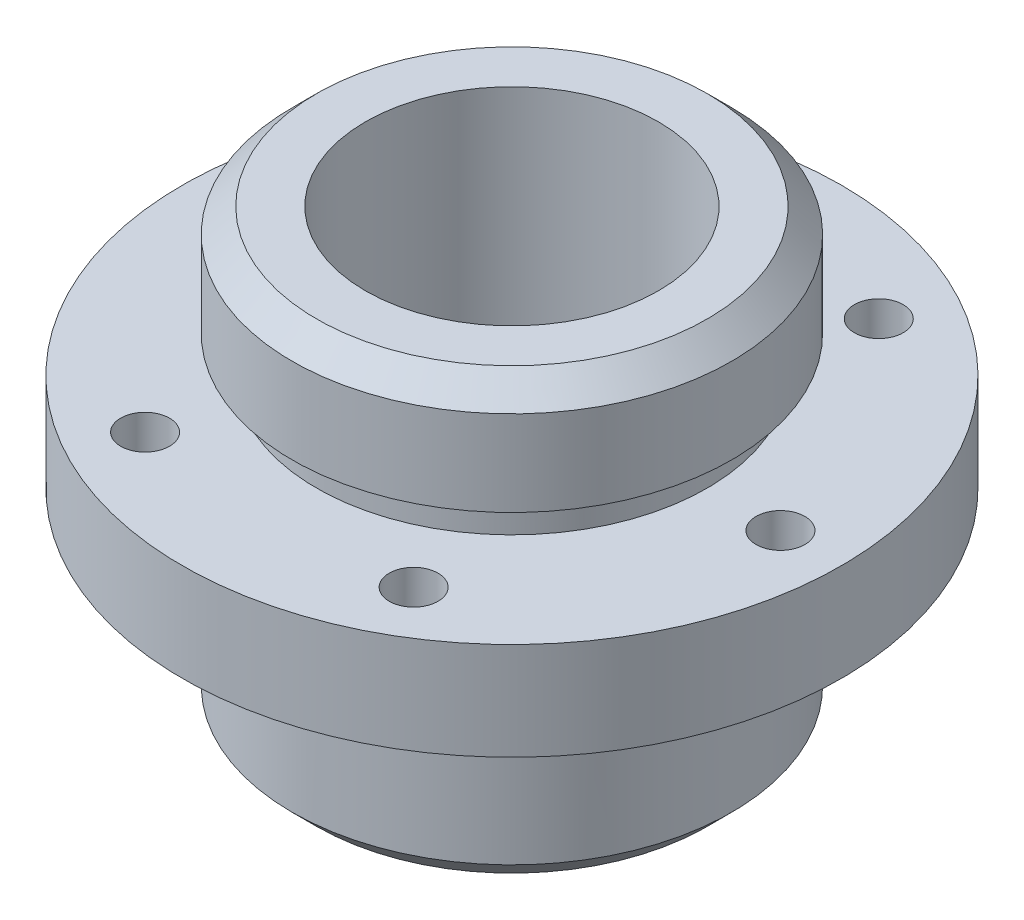
ISO-10303-21;
HEADER;
FILE_DESCRIPTION(('STEP AP214'),'2;1');
FILE_NAME('part.step','',(''),(''),'','','');
FILE_SCHEMA(('AUTOMOTIVE_DESIGN { 1 0 10303 214 1 1 1 1 }'));
ENDSEC;
DATA;
#1=APPLICATION_CONTEXT('core data for automotive mechanical design processes');
#2=APPLICATION_PROTOCOL_DEFINITION('international standard','automotive_design',2000,#1);
#3=PRODUCT_CONTEXT('',#1,'mechanical');
#4=PRODUCT('Part','Part','',(#3));
#5=PRODUCT_RELATED_PRODUCT_CATEGORY('part','',(#4));
#6=PRODUCT_DEFINITION_FORMATION('','',#4);
#7=PRODUCT_DEFINITION_CONTEXT('part definition',#1,'design');
#8=PRODUCT_DEFINITION('design','',#6,#7);
#9=PRODUCT_DEFINITION_SHAPE('','',#8);
#10=(LENGTH_UNIT() NAMED_UNIT(*) SI_UNIT(.MILLI.,.METRE.));
#11=(NAMED_UNIT(*) PLANE_ANGLE_UNIT() SI_UNIT($,.RADIAN.));
#12=(NAMED_UNIT(*) SI_UNIT($,.STERADIAN.) SOLID_ANGLE_UNIT());
#13=UNCERTAINTY_MEASURE_WITH_UNIT(LENGTH_MEASURE(1.E-05),#10,'distance_accuracy_value','');
#14=(GEOMETRIC_REPRESENTATION_CONTEXT(3) GLOBAL_UNCERTAINTY_ASSIGNED_CONTEXT((#13)) GLOBAL_UNIT_ASSIGNED_CONTEXT((#10,
#11,#12)) REPRESENTATION_CONTEXT('',''));
#15=CARTESIAN_POINT('',(0.,0.,0.));
#16=DIRECTION('',(0.,0.,1.));
#17=DIRECTION('',(1.,0.,0.));
#18=AXIS2_PLACEMENT_3D('',#15,#16,#17);
#19=CARTESIAN_POINT('',(-36.,0.,0.));
#20=DIRECTION('',(0.,1.,0.));
#21=DIRECTION('',(0.,0.,1.));
#22=AXIS2_PLACEMENT_3D('',#19,#20,#21);
#23=PLANE('',#22);
#24=CARTESIAN_POINT('',(0.,0.,0.));
#25=DIRECTION('',(0.,1.,0.));
#26=DIRECTION('',(0.,0.,1.));
#27=AXIS2_PLACEMENT_3D('',#24,#25,#26);
#28=CIRCLE('',#27,32.);
#29=CARTESIAN_POINT('',(0.,0.,32.));
#30=VERTEX_POINT('',#29);
#31=EDGE_CURVE('E62',#30,#30,#28,.F.);
#32=ORIENTED_EDGE('',*,*,#31,.T.);
#33=EDGE_LOOP('',(#32));
#34=FACE_BOUND('',#33,.T.);
#35=CARTESIAN_POINT('',(0.,0.,0.));
#36=DIRECTION('',(0.,-1.,0.));
#37=DIRECTION('',(0.,0.,-1.));
#38=AXIS2_PLACEMENT_3D('',#35,#36,#37);
#39=CIRCLE('',#38,24.);
#40=CARTESIAN_POINT('',(0.,0.,-24.));
#41=VERTEX_POINT('',#40);
#42=EDGE_CURVE('E68',#41,#41,#39,.T.);
#43=ORIENTED_EDGE('',*,*,#42,.F.);
#44=EDGE_LOOP('',(#43));
#45=FACE_BOUND('',#44,.T.);
#46=ADVANCED_FACE('F43',(#34,#45),#23,.F.);
#47=CARTESIAN_POINT('',(0.,0.,0.));
#48=DIRECTION('',(0.,-1.,0.));
#49=DIRECTION('',(0.,0.,-1.));
#50=AXIS2_PLACEMENT_3D('',#47,#48,#49);
#51=CYLINDRICAL_SURFACE('',#50,24.);
#52=CARTESIAN_POINT('',(0.,72.,0.));
#53=DIRECTION('',(0.,-1.,0.));
#54=DIRECTION('',(0.,0.,-1.));
#55=AXIS2_PLACEMENT_3D('',#52,#53,#54);
#56=CIRCLE('',#55,24.);
#57=CARTESIAN_POINT('',(0.,72.,-24.));
#58=VERTEX_POINT('',#57);
#59=EDGE_CURVE('E72',#58,#58,#56,.T.);
#60=ORIENTED_EDGE('',*,*,#59,.F.);
#61=EDGE_LOOP('',(#60));
#62=FACE_BOUND('',#61,.T.);
#63=ORIENTED_EDGE('',*,*,#42,.T.);
#64=EDGE_LOOP('',(#63));
#65=FACE_BOUND('',#64,.T.);
#66=ADVANCED_FACE('F218',(#62,#65),#51,.F.);
#67=CARTESIAN_POINT('',(-24.,72.,0.));
#68=DIRECTION('',(0.,-1.,0.));
#69=DIRECTION('',(0.,0.,-1.));
#70=AXIS2_PLACEMENT_3D('',#67,#68,#69);
#71=PLANE('',#70);
#72=CARTESIAN_POINT('',(0.,72.,0.));
#73=DIRECTION('',(0.,-1.,0.));
#74=DIRECTION('',(0.,0.,-1.));
#75=AXIS2_PLACEMENT_3D('',#72,#73,#74);
#76=CIRCLE('',#75,32.);
#77=CARTESIAN_POINT('',(0.,72.,-32.));
#78=VERTEX_POINT('',#77);
#79=EDGE_CURVE('E10',#78,#78,#76,.F.);
#80=ORIENTED_EDGE('',*,*,#79,.T.);
#81=EDGE_LOOP('',(#80));
#82=FACE_BOUND('',#81,.T.);
#83=ORIENTED_EDGE('',*,*,#59,.T.);
#84=EDGE_LOOP('',(#83));
#85=FACE_BOUND('',#84,.T.);
#86=ADVANCED_FACE('F213',(#82,#85),#71,.F.);
#87=CARTESIAN_POINT('',(0.,0.,0.));
#88=DIRECTION('',(0.,-1.,0.));
#89=DIRECTION('',(0.,0.,-1.));
#90=AXIS2_PLACEMENT_3D('',#87,#88,#89);
#91=CYLINDRICAL_SURFACE('',#90,36.);
#92=CARTESIAN_POINT('',(0.,68.,0.));
#93=DIRECTION('',(0.,-1.,0.));
#94=DIRECTION('',(0.,0.,-1.));
#95=AXIS2_PLACEMENT_3D('',#92,#93,#94);
#96=CIRCLE('',#95,36.);
#97=CARTESIAN_POINT('',(0.,68.,-36.));
#98=VERTEX_POINT('',#97);
#99=EDGE_CURVE('E52',#98,#98,#96,.T.);
#100=ORIENTED_EDGE('',*,*,#99,.T.);
#101=EDGE_LOOP('',(#100));
#102=FACE_BOUND('',#101,.T.);
#103=CARTESIAN_POINT('',(0.,54.,0.));
#104=DIRECTION('',(0.,-1.,0.));
#105=DIRECTION('',(0.,0.,-1.));
#106=AXIS2_PLACEMENT_3D('',#103,#104,#105);
#107=CIRCLE('',#106,36.);
#108=CARTESIAN_POINT('',(0.,54.,-36.));
#109=VERTEX_POINT('',#108);
#110=EDGE_CURVE('E76',#109,#109,#107,.T.);
#111=ORIENTED_EDGE('',*,*,#110,.F.);
#112=EDGE_LOOP('',(#111));
#113=FACE_BOUND('',#112,.T.);
#114=ADVANCED_FACE('F208',(#102,#113),#91,.T.);
#115=CARTESIAN_POINT('',(-36.,54.,0.));
#116=DIRECTION('',(0.,1.,0.));
#117=DIRECTION('',(0.,0.,1.));
#118=AXIS2_PLACEMENT_3D('',#115,#116,#117);
#119=PLANE('',#118);
#120=CARTESIAN_POINT('',(0.,54.,0.));
#121=DIRECTION('',(0.,-1.,0.));
#122=DIRECTION('',(0.,0.,-1.));
#123=AXIS2_PLACEMENT_3D('',#120,#121,#122);
#124=CIRCLE('',#123,34.8823067684916);
#125=CARTESIAN_POINT('',(0.,54.,-34.8823067684916));
#126=VERTEX_POINT('',#125);
#127=EDGE_CURVE('E80',#126,#126,#124,.T.);
#128=ORIENTED_EDGE('',*,*,#127,.F.);
#129=EDGE_LOOP('',(#128));
#130=FACE_BOUND('',#129,.T.);
#131=ORIENTED_EDGE('',*,*,#110,.T.);
#132=EDGE_LOOP('',(#131));
#133=FACE_BOUND('',#132,.T.);
#134=ADVANCED_FACE('F202',(#130,#133),#119,.F.);
#135=CARTESIAN_POINT('',(0.,50.0392310771694,0.));
#136=DIRECTION('',(0.,-1.,0.));
#137=DIRECTION('',(0.,0.,-1.));
#138=AXIS2_PLACEMENT_3D('',#135,#136,#137);
#139=TOROIDAL_SURFACE('',#138,35.4411533842458,4.);
#140=CARTESIAN_POINT('',(0.,52.8127320582956,0.));
#141=DIRECTION('',(0.,-1.,0.));
#142=DIRECTION('',(0.,0.,-1.));
#143=AXIS2_PLACEMENT_3D('',#140,#141,#142);
#144=CIRCLE('',#143,32.5588466157542);
#145=CARTESIAN_POINT('',(0.,52.8127320582956,-32.5588466157542));
#146=VERTEX_POINT('',#145);
#147=EDGE_CURVE('E84',#146,#146,#144,.T.);
#148=ORIENTED_EDGE('',*,*,#147,.F.);
#149=EDGE_LOOP('',(#148));
#150=FACE_BOUND('',#149,.T.);
#151=ORIENTED_EDGE('',*,*,#127,.T.);
#152=EDGE_LOOP('',(#151));
#153=FACE_BOUND('',#152,.T.);
#154=ADVANCED_FACE('F196',(#150,#153),#139,.F.);
#155=CARTESIAN_POINT('',(0.,51.4259815677325,0.));
#156=DIRECTION('',(0.,-1.,0.));
#157=DIRECTION('',(0.,0.,-1.));
#158=AXIS2_PLACEMENT_3D('',#155,#156,#157);
#159=TOROIDAL_SURFACE('',#158,34.,2.);
#160=CARTESIAN_POINT('',(0.,51.4259815677325,0.));
#161=DIRECTION('',(0.,-1.,0.));
#162=DIRECTION('',(0.,0.,-1.));
#163=AXIS2_PLACEMENT_3D('',#160,#161,#162);
#164=CIRCLE('',#163,32.);
#165=CARTESIAN_POINT('',(0.,51.4259815677325,-32.));
#166=VERTEX_POINT('',#165);
#167=EDGE_CURVE('E88',#166,#166,#164,.T.);
#168=ORIENTED_EDGE('',*,*,#167,.F.);
#169=EDGE_LOOP('',(#168));
#170=FACE_BOUND('',#169,.T.);
#171=ORIENTED_EDGE('',*,*,#147,.T.);
#172=EDGE_LOOP('',(#171));
#173=FACE_BOUND('',#172,.T.);
#174=ADVANCED_FACE('F190',(#170,#173),#159,.F.);
#175=CARTESIAN_POINT('',(0.,0.,0.));
#176=DIRECTION('',(0.,-1.,0.));
#177=DIRECTION('',(0.,0.,-1.));
#178=AXIS2_PLACEMENT_3D('',#175,#176,#177);
#179=CYLINDRICAL_SURFACE('',#178,32.);
#180=CARTESIAN_POINT('',(0.,48.,0.));
#181=DIRECTION('',(0.,-1.,0.));
#182=DIRECTION('',(0.,0.,-1.));
#183=AXIS2_PLACEMENT_3D('',#180,#181,#182);
#184=CIRCLE('',#183,32.);
#185=CARTESIAN_POINT('',(0.,48.,-32.));
#186=VERTEX_POINT('',#185);
#187=EDGE_CURVE('E92',#186,#186,#184,.T.);
#188=ORIENTED_EDGE('',*,*,#187,.F.);
#189=EDGE_LOOP('',(#188));
#190=FACE_BOUND('',#189,.T.);
#191=ORIENTED_EDGE('',*,*,#167,.T.);
#192=EDGE_LOOP('',(#191));
#193=FACE_BOUND('',#192,.T.);
#194=ADVANCED_FACE('F172',(#190,#193),#179,.T.);
#195=CARTESIAN_POINT('',(-32.,48.,0.));
#196=DIRECTION('',(0.,-1.,0.));
#197=DIRECTION('',(0.,0.,-1.));
#198=AXIS2_PLACEMENT_3D('',#195,#196,#197);
#199=PLANE('',#198);
#200=CARTESIAN_POINT('',(44.,48.,0.));
#201=DIRECTION('',(0.,1.,0.));
#202=DIRECTION('',(0.,0.,1.));
#203=AXIS2_PLACEMENT_3D('',#200,#201,#202);
#204=CIRCLE('',#203,4.);
#205=CARTESIAN_POINT('',(44.,48.,4.));
#206=VERTEX_POINT('',#205);
#207=EDGE_CURVE('E147',#206,#206,#204,.T.);
#208=ORIENTED_EDGE('',*,*,#207,.F.);
#209=EDGE_LOOP('',(#208));
#210=FACE_BOUND('',#209,.T.);
#211=CARTESIAN_POINT('',(22.0000000000004,48.,-38.105117766515));
#212=DIRECTION('',(0.,1.,0.));
#213=DIRECTION('',(0.,0.,1.));
#214=AXIS2_PLACEMENT_3D('',#211,#212,#213);
#215=CIRCLE('',#214,3.99999999999999);
#216=CARTESIAN_POINT('',(22.0000000000004,48.,-34.105117766515));
#217=VERTEX_POINT('',#216);
#218=EDGE_CURVE('E126',#217,#217,#215,.T.);
#219=ORIENTED_EDGE('',*,*,#218,.F.);
#220=EDGE_LOOP('',(#219));
#221=FACE_BOUND('',#220,.T.);
#222=CARTESIAN_POINT('',(-21.9999999999996,48.,-38.1051177665155));
#223=DIRECTION('',(0.,1.,0.));
#224=DIRECTION('',(0.,0.,1.));
#225=AXIS2_PLACEMENT_3D('',#222,#223,#224);
#226=CIRCLE('',#225,4.);
#227=CARTESIAN_POINT('',(-21.9999999999996,48.,-34.1051177665155));
#228=VERTEX_POINT('',#227);
#229=EDGE_CURVE('E117',#228,#228,#226,.T.);
#230=ORIENTED_EDGE('',*,*,#229,.F.);
#231=EDGE_LOOP('',(#230));
#232=FACE_BOUND('',#231,.T.);
#233=CARTESIAN_POINT('',(-44.,48.,-3.07250357818196E-13));
#234=DIRECTION('',(0.,1.,0.));
#235=DIRECTION('',(0.,0.,1.));
#236=AXIS2_PLACEMENT_3D('',#233,#234,#235);
#237=CIRCLE('',#236,4.);
#238=CARTESIAN_POINT('',(-44.,48.,3.99999999999969));
#239=VERTEX_POINT('',#238);
#240=EDGE_CURVE('E127',#239,#239,#237,.T.);
#241=ORIENTED_EDGE('',*,*,#240,.F.);
#242=EDGE_LOOP('',(#241));
#243=FACE_BOUND('',#242,.T.);
#244=CARTESIAN_POINT('',(-22.0000000000002,48.,38.1051177665152));
#245=DIRECTION('',(0.,1.,0.));
#246=DIRECTION('',(0.,0.,1.));
#247=AXIS2_PLACEMENT_3D('',#244,#245,#246);
#248=CIRCLE('',#247,4.);
#249=CARTESIAN_POINT('',(-22.0000000000002,48.,42.1051177665152));
#250=VERTEX_POINT('',#249);
#251=EDGE_CURVE('E135',#250,#250,#248,.T.);
#252=ORIENTED_EDGE('',*,*,#251,.F.);
#253=EDGE_LOOP('',(#252));
#254=FACE_BOUND('',#253,.T.);
#255=CARTESIAN_POINT('',(21.9999999999999,48.,38.1051177665154));
#256=DIRECTION('',(0.,1.,0.));
#257=DIRECTION('',(0.,0.,1.));
#258=AXIS2_PLACEMENT_3D('',#255,#256,#257);
#259=CIRCLE('',#258,4.);
#260=CARTESIAN_POINT('',(21.9999999999999,48.,42.1051177665154));
#261=VERTEX_POINT('',#260);
#262=EDGE_CURVE('E143',#261,#261,#259,.T.);
#263=ORIENTED_EDGE('',*,*,#262,.F.);
#264=EDGE_LOOP('',(#263));
#265=FACE_BOUND('',#264,.T.);
#266=CARTESIAN_POINT('',(0.,48.,0.));
#267=DIRECTION('',(0.,-1.,0.));
#268=DIRECTION('',(0.,0.,-1.));
#269=AXIS2_PLACEMENT_3D('',#266,#267,#268);
#270=CIRCLE('',#269,54.);
#271=CARTESIAN_POINT('',(0.,48.,-54.));
#272=VERTEX_POINT('',#271);
#273=EDGE_CURVE('E96',#272,#272,#270,.T.);
#274=ORIENTED_EDGE('',*,*,#273,.F.);
#275=EDGE_LOOP('',(#274));
#276=FACE_BOUND('',#275,.T.);
#277=ORIENTED_EDGE('',*,*,#187,.T.);
#278=EDGE_LOOP('',(#277));
#279=FACE_BOUND('',#278,.T.);
#280=ADVANCED_FACE('F168',(#210,#221,#232,#243,#254,#265,#276,#279),#199,.F.);
#281=CARTESIAN_POINT('',(0.,0.,0.));
#282=DIRECTION('',(0.,-1.,0.));
#283=DIRECTION('',(0.,0.,-1.));
#284=AXIS2_PLACEMENT_3D('',#281,#282,#283);
#285=CYLINDRICAL_SURFACE('',#284,54.);
#286=CARTESIAN_POINT('',(0.,32.,0.));
#287=DIRECTION('',(0.,-1.,0.));
#288=DIRECTION('',(0.,0.,-1.));
#289=AXIS2_PLACEMENT_3D('',#286,#287,#288);
#290=CIRCLE('',#289,54.);
#291=CARTESIAN_POINT('',(0.,32.,-54.));
#292=VERTEX_POINT('',#291);
#293=EDGE_CURVE('E100',#292,#292,#290,.T.);
#294=ORIENTED_EDGE('',*,*,#293,.F.);
#295=EDGE_LOOP('',(#294));
#296=FACE_BOUND('',#295,.T.);
#297=ORIENTED_EDGE('',*,*,#273,.T.);
#298=EDGE_LOOP('',(#297));
#299=FACE_BOUND('',#298,.T.);
#300=ADVANCED_FACE('F171',(#296,#299),#285,.T.);
#301=CARTESIAN_POINT('',(-54.,32.,0.));
#302=DIRECTION('',(0.,1.,0.));
#303=DIRECTION('',(0.,0.,1.));
#304=AXIS2_PLACEMENT_3D('',#301,#302,#303);
#305=PLANE('',#304);
#306=CARTESIAN_POINT('',(44.,32.,0.));
#307=DIRECTION('',(0.,1.,0.));
#308=DIRECTION('',(0.,0.,1.));
#309=AXIS2_PLACEMENT_3D('',#306,#307,#308);
#310=CIRCLE('',#309,4.);
#311=CARTESIAN_POINT('',(44.,32.,4.));
#312=VERTEX_POINT('',#311);
#313=EDGE_CURVE('E116',#312,#312,#310,.F.);
#314=ORIENTED_EDGE('',*,*,#313,.F.);
#315=EDGE_LOOP('',(#314));
#316=FACE_BOUND('',#315,.T.);
#317=CARTESIAN_POINT('',(22.0000000000004,32.,-38.105117766515));
#318=DIRECTION('',(0.,1.,0.));
#319=DIRECTION('',(0.,0.,1.));
#320=AXIS2_PLACEMENT_3D('',#317,#318,#319);
#321=CIRCLE('',#320,3.99999999999999);
#322=CARTESIAN_POINT('',(22.0000000000004,32.,-34.105117766515));
#323=VERTEX_POINT('',#322);
#324=EDGE_CURVE('E154',#323,#323,#321,.F.);
#325=ORIENTED_EDGE('',*,*,#324,.F.);
#326=EDGE_LOOP('',(#325));
#327=FACE_BOUND('',#326,.T.);
#328=CARTESIAN_POINT('',(-21.9999999999996,32.,-38.1051177665155));
#329=DIRECTION('',(0.,1.,0.));
#330=DIRECTION('',(0.,0.,1.));
#331=AXIS2_PLACEMENT_3D('',#328,#329,#330);
#332=CIRCLE('',#331,4.);
#333=CARTESIAN_POINT('',(-21.9999999999996,32.,-34.1051177665155));
#334=VERTEX_POINT('',#333);
#335=EDGE_CURVE('E122',#334,#334,#332,.F.);
#336=ORIENTED_EDGE('',*,*,#335,.F.);
#337=EDGE_LOOP('',(#336));
#338=FACE_BOUND('',#337,.T.);
#339=CARTESIAN_POINT('',(-44.,32.,-3.07250357818196E-13));
#340=DIRECTION('',(0.,1.,0.));
#341=DIRECTION('',(0.,0.,1.));
#342=AXIS2_PLACEMENT_3D('',#339,#340,#341);
#343=CIRCLE('',#342,4.);
#344=CARTESIAN_POINT('',(-44.,32.,3.99999999999969));
#345=VERTEX_POINT('',#344);
#346=EDGE_CURVE('E121',#345,#345,#343,.F.);
#347=ORIENTED_EDGE('',*,*,#346,.F.);
#348=EDGE_LOOP('',(#347));
#349=FACE_BOUND('',#348,.T.);
#350=CARTESIAN_POINT('',(-22.0000000000002,32.,38.1051177665152));
#351=DIRECTION('',(0.,1.,0.));
#352=DIRECTION('',(0.,0.,1.));
#353=AXIS2_PLACEMENT_3D('',#350,#351,#352);
#354=CIRCLE('',#353,4.);
#355=CARTESIAN_POINT('',(-22.0000000000002,32.,42.1051177665152));
#356=VERTEX_POINT('',#355);
#357=EDGE_CURVE('E131',#356,#356,#354,.F.);
#358=ORIENTED_EDGE('',*,*,#357,.F.);
#359=EDGE_LOOP('',(#358));
#360=FACE_BOUND('',#359,.T.);
#361=CARTESIAN_POINT('',(21.9999999999999,32.,38.1051177665154));
#362=DIRECTION('',(0.,1.,0.));
#363=DIRECTION('',(0.,0.,1.));
#364=AXIS2_PLACEMENT_3D('',#361,#362,#363);
#365=CIRCLE('',#364,4.);
#366=CARTESIAN_POINT('',(21.9999999999999,32.,42.1051177665154));
#367=VERTEX_POINT('',#366);
#368=EDGE_CURVE('E139',#367,#367,#365,.F.);
#369=ORIENTED_EDGE('',*,*,#368,.F.);
#370=EDGE_LOOP('',(#369));
#371=FACE_BOUND('',#370,.T.);
#372=CARTESIAN_POINT('',(0.,32.,0.));
#373=DIRECTION('',(0.,-1.,0.));
#374=DIRECTION('',(0.,0.,-1.));
#375=AXIS2_PLACEMENT_3D('',#372,#373,#374);
#376=CIRCLE('',#375,32.);
#377=CARTESIAN_POINT('',(0.,32.,-32.));
#378=VERTEX_POINT('',#377);
#379=EDGE_CURVE('E104',#378,#378,#376,.T.);
#380=ORIENTED_EDGE('',*,*,#379,.F.);
#381=EDGE_LOOP('',(#380));
#382=FACE_BOUND('',#381,.T.);
#383=ORIENTED_EDGE('',*,*,#293,.T.);
#384=EDGE_LOOP('',(#383));
#385=FACE_BOUND('',#384,.T.);
#386=ADVANCED_FACE('F259',(#316,#327,#338,#349,#360,#371,#382,#385),#305,.F.);
#387=CARTESIAN_POINT('',(0.,0.,0.));
#388=DIRECTION('',(0.,-1.,0.));
#389=DIRECTION('',(0.,0.,-1.));
#390=AXIS2_PLACEMENT_3D('',#387,#388,#389);
#391=CYLINDRICAL_SURFACE('',#390,32.);
#392=CARTESIAN_POINT('',(0.,28.,0.));
#393=DIRECTION('',(0.,-1.,0.));
#394=DIRECTION('',(0.,0.,-1.));
#395=AXIS2_PLACEMENT_3D('',#392,#393,#394);
#396=CIRCLE('',#395,32.);
#397=CARTESIAN_POINT('',(0.,28.,-32.));
#398=VERTEX_POINT('',#397);
#399=EDGE_CURVE('E108',#398,#398,#396,.T.);
#400=ORIENTED_EDGE('',*,*,#399,.F.);
#401=EDGE_LOOP('',(#400));
#402=FACE_BOUND('',#401,.T.);
#403=ORIENTED_EDGE('',*,*,#379,.T.);
#404=EDGE_LOOP('',(#403));
#405=FACE_BOUND('',#404,.T.);
#406=ADVANCED_FACE('F253',(#402,#405),#391,.T.);
#407=CARTESIAN_POINT('',(0.,28.,0.));
#408=DIRECTION('',(0.,-1.,0.));
#409=DIRECTION('',(0.,0.,-1.));
#410=AXIS2_PLACEMENT_3D('',#407,#408,#409);
#411=TOROIDAL_SURFACE('',#410,36.,4.00000000000001);
#412=CARTESIAN_POINT('',(0.,24.,0.));
#413=DIRECTION('',(0.,-1.,0.));
#414=DIRECTION('',(0.,0.,-1.));
#415=AXIS2_PLACEMENT_3D('',#412,#413,#414);
#416=CIRCLE('',#415,36.);
#417=CARTESIAN_POINT('',(0.,24.,-36.));
#418=VERTEX_POINT('',#417);
#419=EDGE_CURVE('E112',#418,#418,#416,.T.);
#420=ORIENTED_EDGE('',*,*,#419,.F.);
#421=EDGE_LOOP('',(#420));
#422=FACE_BOUND('',#421,.T.);
#423=ORIENTED_EDGE('',*,*,#399,.T.);
#424=EDGE_LOOP('',(#423));
#425=FACE_BOUND('',#424,.T.);
#426=ADVANCED_FACE('F242',(#422,#425),#411,.F.);
#427=CARTESIAN_POINT('',(0.,0.,0.));
#428=DIRECTION('',(0.,-1.,0.));
#429=DIRECTION('',(0.,0.,-1.));
#430=AXIS2_PLACEMENT_3D('',#427,#428,#429);
#431=CYLINDRICAL_SURFACE('',#430,36.);
#432=CARTESIAN_POINT('',(0.,4.,0.));
#433=DIRECTION('',(0.,1.,0.));
#434=DIRECTION('',(0.,0.,1.));
#435=AXIS2_PLACEMENT_3D('',#432,#433,#434);
#436=CIRCLE('',#435,36.);
#437=CARTESIAN_POINT('',(0.,4.,36.));
#438=VERTEX_POINT('',#437);
#439=EDGE_CURVE('E57',#438,#438,#436,.T.);
#440=ORIENTED_EDGE('',*,*,#439,.T.);
#441=EDGE_LOOP('',(#440));
#442=FACE_BOUND('',#441,.T.);
#443=ORIENTED_EDGE('',*,*,#419,.T.);
#444=EDGE_LOOP('',(#443));
#445=FACE_BOUND('',#444,.T.);
#446=ADVANCED_FACE('F234',(#442,#445),#431,.T.);
#447=CARTESIAN_POINT('',(0.,0.,0.));
#448=DIRECTION('',(0.,1.,0.));
#449=DIRECTION('',(0.,0.,1.));
#450=AXIS2_PLACEMENT_3D('',#447,#448,#449);
#451=CONICAL_SURFACE('',#450,32.,0.785398163397448);
#452=ORIENTED_EDGE('',*,*,#439,.F.);
#453=EDGE_LOOP('',(#452));
#454=FACE_BOUND('',#453,.T.);
#455=ORIENTED_EDGE('',*,*,#31,.F.);
#456=EDGE_LOOP('',(#455));
#457=FACE_BOUND('',#456,.T.);
#458=ADVANCED_FACE('F230',(#454,#457),#451,.T.);
#459=CARTESIAN_POINT('',(0.,68.,0.));
#460=DIRECTION('',(0.,-1.,0.));
#461=DIRECTION('',(0.,0.,-1.));
#462=AXIS2_PLACEMENT_3D('',#459,#460,#461);
#463=CONICAL_SURFACE('',#462,36.,0.785398163397451);
#464=ORIENTED_EDGE('',*,*,#79,.F.);
#465=EDGE_LOOP('',(#464));
#466=FACE_BOUND('',#465,.T.);
#467=ORIENTED_EDGE('',*,*,#99,.F.);
#468=EDGE_LOOP('',(#467));
#469=FACE_BOUND('',#468,.T.);
#470=ADVANCED_FACE('F46',(#466,#469),#463,.T.);
#471=CARTESIAN_POINT('',(21.9999999999999,-0.001000000000001,38.1051177665154));
#472=DIRECTION('',(0.,1.,0.));
#473=DIRECTION('',(0.,0.,1.));
#474=AXIS2_PLACEMENT_3D('',#471,#472,#473);
#475=CYLINDRICAL_SURFACE('',#474,4.);
#476=ORIENTED_EDGE('',*,*,#262,.T.);
#477=EDGE_LOOP('',(#476));
#478=FACE_BOUND('',#477,.T.);
#479=ORIENTED_EDGE('',*,*,#368,.T.);
#480=EDGE_LOOP('',(#479));
#481=FACE_BOUND('',#480,.T.);
#482=ADVANCED_FACE('F240',(#478,#481),#475,.F.);
#483=CARTESIAN_POINT('',(-22.0000000000002,-0.001000000000001,38.1051177665152));
#484=DIRECTION('',(0.,1.,0.));
#485=DIRECTION('',(0.,0.,1.));
#486=AXIS2_PLACEMENT_3D('',#483,#484,#485);
#487=CYLINDRICAL_SURFACE('',#486,4.);
#488=ORIENTED_EDGE('',*,*,#251,.T.);
#489=EDGE_LOOP('',(#488));
#490=FACE_BOUND('',#489,.T.);
#491=ORIENTED_EDGE('',*,*,#357,.T.);
#492=EDGE_LOOP('',(#491));
#493=FACE_BOUND('',#492,.T.);
#494=ADVANCED_FACE('F283',(#490,#493),#487,.F.);
#495=CARTESIAN_POINT('',(-44.,-0.001000000000001,-3.07250357818196E-13));
#496=DIRECTION('',(0.,1.,0.));
#497=DIRECTION('',(0.,0.,1.));
#498=AXIS2_PLACEMENT_3D('',#495,#496,#497);
#499=CYLINDRICAL_SURFACE('',#498,4.);
#500=ORIENTED_EDGE('',*,*,#240,.T.);
#501=EDGE_LOOP('',(#500));
#502=FACE_BOUND('',#501,.T.);
#503=ORIENTED_EDGE('',*,*,#346,.T.);
#504=EDGE_LOOP('',(#503));
#505=FACE_BOUND('',#504,.T.);
#506=ADVANCED_FACE('F279',(#502,#505),#499,.F.);
#507=CARTESIAN_POINT('',(-21.9999999999996,-0.001000000000001,-38.1051177665155));
#508=DIRECTION('',(0.,1.,0.));
#509=DIRECTION('',(0.,0.,1.));
#510=AXIS2_PLACEMENT_3D('',#507,#508,#509);
#511=CYLINDRICAL_SURFACE('',#510,4.);
#512=ORIENTED_EDGE('',*,*,#229,.T.);
#513=EDGE_LOOP('',(#512));
#514=FACE_BOUND('',#513,.T.);
#515=ORIENTED_EDGE('',*,*,#335,.T.);
#516=EDGE_LOOP('',(#515));
#517=FACE_BOUND('',#516,.T.);
#518=ADVANCED_FACE('F275',(#514,#517),#511,.F.);
#519=CARTESIAN_POINT('',(22.0000000000004,-0.001000000000001,-38.105117766515));
#520=DIRECTION('',(0.,1.,0.));
#521=DIRECTION('',(0.,0.,1.));
#522=AXIS2_PLACEMENT_3D('',#519,#520,#521);
#523=CYLINDRICAL_SURFACE('',#522,3.99999999999999);
#524=ORIENTED_EDGE('',*,*,#218,.T.);
#525=EDGE_LOOP('',(#524));
#526=FACE_BOUND('',#525,.T.);
#527=ORIENTED_EDGE('',*,*,#324,.T.);
#528=EDGE_LOOP('',(#527));
#529=FACE_BOUND('',#528,.T.);
#530=ADVANCED_FACE('F278',(#526,#529),#523,.F.);
#531=CARTESIAN_POINT('',(44.,-0.001000000000001,0.));
#532=DIRECTION('',(0.,1.,0.));
#533=DIRECTION('',(0.,0.,1.));
#534=AXIS2_PLACEMENT_3D('',#531,#532,#533);
#535=CYLINDRICAL_SURFACE('',#534,4.);
#536=ORIENTED_EDGE('',*,*,#207,.T.);
#537=EDGE_LOOP('',(#536));
#538=FACE_BOUND('',#537,.T.);
#539=ORIENTED_EDGE('',*,*,#313,.T.);
#540=EDGE_LOOP('',(#539));
#541=FACE_BOUND('',#540,.T.);
#542=ADVANCED_FACE('F165',(#538,#541),#535,.F.);
#543=CLOSED_SHELL('',(#46,#66,#86,#114,#134,#154,#174,#194,#280,#300,#386,#406,#426,#446,#458,
#470,#482,#494,#506,#518,#530,#542));
#544=MANIFOLD_SOLID_BREP('B2',#543);
#545=ADVANCED_BREP_SHAPE_REPRESENTATION('',(#18,#544),#14);
#546=SHAPE_DEFINITION_REPRESENTATION(#9,#545);
ENDSEC;
END-ISO-10303-21;
